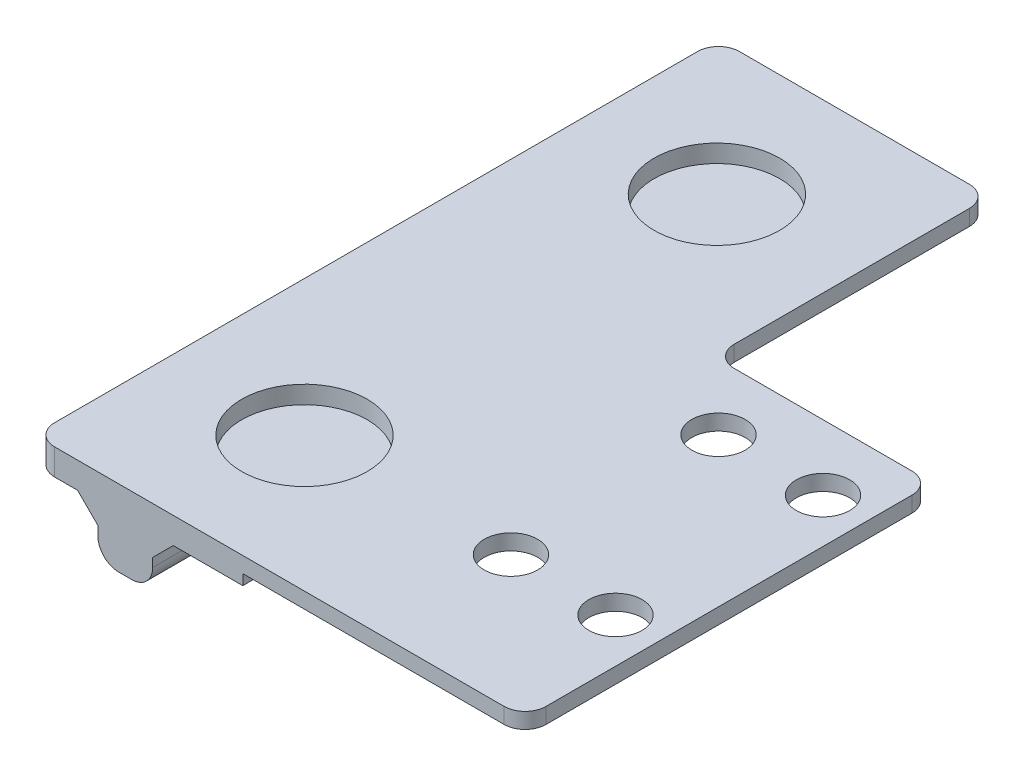
ISO-10303-21;
HEADER;
FILE_DESCRIPTION(('STEP AP214'),'2;1');
FILE_NAME('part.step','',(''),(''),'','','');
FILE_SCHEMA(('AUTOMOTIVE_DESIGN { 1 0 10303 214 1 1 1 1 }'));
ENDSEC;
DATA;
#1=APPLICATION_CONTEXT('core data for automotive mechanical design processes');
#2=APPLICATION_PROTOCOL_DEFINITION('international standard','automotive_design',2000,#1);
#3=PRODUCT_CONTEXT('',#1,'mechanical');
#4=PRODUCT('Part','Part','',(#3));
#5=PRODUCT_RELATED_PRODUCT_CATEGORY('part','',(#4));
#6=PRODUCT_DEFINITION_FORMATION('','',#4);
#7=PRODUCT_DEFINITION_CONTEXT('part definition',#1,'design');
#8=PRODUCT_DEFINITION('design','',#6,#7);
#9=PRODUCT_DEFINITION_SHAPE('','',#8);
#10=(LENGTH_UNIT() NAMED_UNIT(*) SI_UNIT(.MILLI.,.METRE.));
#11=(NAMED_UNIT(*) PLANE_ANGLE_UNIT() SI_UNIT($,.RADIAN.));
#12=(NAMED_UNIT(*) SI_UNIT($,.STERADIAN.) SOLID_ANGLE_UNIT());
#13=UNCERTAINTY_MEASURE_WITH_UNIT(LENGTH_MEASURE(1.E-05),#10,'distance_accuracy_value','');
#14=(GEOMETRIC_REPRESENTATION_CONTEXT(3) GLOBAL_UNCERTAINTY_ASSIGNED_CONTEXT((#13)) GLOBAL_UNIT_ASSIGNED_CONTEXT((#10,
#11,#12)) REPRESENTATION_CONTEXT('',''));
#15=CARTESIAN_POINT('',(0.,0.,0.));
#16=DIRECTION('',(0.,0.,1.));
#17=DIRECTION('',(1.,0.,0.));
#18=AXIS2_PLACEMENT_3D('',#15,#16,#17);
#19=CARTESIAN_POINT('',(-9.99999999999999,1.25,65.5));
#20=DIRECTION('',(0.,-1.,0.));
#21=DIRECTION('',(0.,0.,-1.));
#22=AXIS2_PLACEMENT_3D('',#19,#20,#21);
#23=PLANE('',#22);
#24=CARTESIAN_POINT('',(2.75,1.25,12.9));
#25=DIRECTION('',(0.,-1.,0.));
#26=DIRECTION('',(0.,0.,-1.));
#27=AXIS2_PLACEMENT_3D('',#24,#25,#26);
#28=CIRCLE('',#27,6.);
#29=CARTESIAN_POINT('',(2.75,1.25,6.9));
#30=VERTEX_POINT('',#29);
#31=EDGE_CURVE('E390',#30,#30,#28,.T.);
#32=ORIENTED_EDGE('',*,*,#31,.T.);
#33=EDGE_LOOP('',(#32));
#34=FACE_BOUND('',#33,.T.);
#35=CARTESIAN_POINT('',(3.00000000000001,1.25,52.6));
#36=DIRECTION('',(0.,-1.,0.));
#37=DIRECTION('',(0.,0.,-1.));
#38=AXIS2_PLACEMENT_3D('',#35,#36,#37);
#39=CIRCLE('',#38,6.);
#40=CARTESIAN_POINT('',(3.00000000000001,1.25,46.6));
#41=VERTEX_POINT('',#40);
#42=EDGE_CURVE('E383',#41,#41,#39,.T.);
#43=ORIENTED_EDGE('',*,*,#42,.T.);
#44=EDGE_LOOP('',(#43));
#45=FACE_BOUND('',#44,.T.);
#46=DIRECTION('',(0.,0.,-1.));
#47=VECTOR('',#46,1.);
#48=CARTESIAN_POINT('',(16.,1.25,65.5));
#49=LINE('',#48,#47);
#50=CARTESIAN_POINT('',(16.,1.25,24.5));
#51=VERTEX_POINT('',#50);
#52=CARTESIAN_POINT('',(16.,1.25,2.));
#53=VERTEX_POINT('',#52);
#54=EDGE_CURVE('E226',#51,#53,#49,.T.);
#55=ORIENTED_EDGE('',*,*,#54,.T.);
#56=CARTESIAN_POINT('',(14.,1.25,2.));
#57=DIRECTION('',(0.,-1.,0.));
#58=DIRECTION('',(0.,0.,-1.));
#59=AXIS2_PLACEMENT_3D('',#56,#57,#58);
#60=CIRCLE('',#59,2.);
#61=CARTESIAN_POINT('',(14.,1.25,0.));
#62=VERTEX_POINT('',#61);
#63=EDGE_CURVE('E287',#53,#62,#60,.F.);
#64=ORIENTED_EDGE('',*,*,#63,.T.);
#65=DIRECTION('',(-1.,0.,0.));
#66=VECTOR('',#65,1.);
#67=CARTESIAN_POINT('',(-9.99999999999999,1.25,0.));
#68=LINE('',#67,#66);
#69=CARTESIAN_POINT('',(-7.99999999999999,1.25,0.));
#70=VERTEX_POINT('',#69);
#71=EDGE_CURVE('E227',#62,#70,#68,.T.);
#72=ORIENTED_EDGE('',*,*,#71,.T.);
#73=CARTESIAN_POINT('',(-7.99999999999999,1.25,2.));
#74=DIRECTION('',(0.,-1.,0.));
#75=DIRECTION('',(0.,0.,-1.));
#76=AXIS2_PLACEMENT_3D('',#73,#74,#75);
#77=CIRCLE('',#76,2.);
#78=CARTESIAN_POINT('',(-9.99999999999999,1.25,2.));
#79=VERTEX_POINT('',#78);
#80=EDGE_CURVE('E283',#70,#79,#77,.F.);
#81=ORIENTED_EDGE('',*,*,#80,.T.);
#82=DIRECTION('',(0.,0.,-1.));
#83=VECTOR('',#82,1.);
#84=CARTESIAN_POINT('',(-9.99999999999999,1.25,65.5));
#85=LINE('',#84,#83);
#86=CARTESIAN_POINT('',(-9.99999999999999,1.25,63.5));
#87=VERTEX_POINT('',#86);
#88=EDGE_CURVE('E270',#87,#79,#85,.T.);
#89=ORIENTED_EDGE('',*,*,#88,.F.);
#90=CARTESIAN_POINT('',(-7.99999999999999,1.25,63.5));
#91=DIRECTION('',(0.,-1.,0.));
#92=DIRECTION('',(0.,0.,-1.));
#93=AXIS2_PLACEMENT_3D('',#90,#91,#92);
#94=CIRCLE('',#93,2.);
#95=CARTESIAN_POINT('',(-7.99999999999999,1.25,65.5));
#96=VERTEX_POINT('',#95);
#97=EDGE_CURVE('E285',#87,#96,#94,.F.);
#98=ORIENTED_EDGE('',*,*,#97,.T.);
#99=DIRECTION('',(-1.,0.,0.));
#100=VECTOR('',#99,1.);
#101=CARTESIAN_POINT('',(10.,1.25,65.5));
#102=LINE('',#101,#100);
#103=CARTESIAN_POINT('',(35.,1.25,65.5));
#104=VERTEX_POINT('',#103);
#105=EDGE_CURVE('E192',#104,#96,#102,.T.);
#106=ORIENTED_EDGE('',*,*,#105,.F.);
#107=CARTESIAN_POINT('',(35.,1.25,63.5));
#108=DIRECTION('',(0.,-1.,0.));
#109=DIRECTION('',(0.,0.,-1.));
#110=AXIS2_PLACEMENT_3D('',#107,#108,#109);
#111=CIRCLE('',#110,2.);
#112=CARTESIAN_POINT('',(37.,1.25,63.5));
#113=VERTEX_POINT('',#112);
#114=EDGE_CURVE('E279',#104,#113,#111,.F.);
#115=ORIENTED_EDGE('',*,*,#114,.T.);
#116=DIRECTION('',(0.,0.,1.));
#117=VECTOR('',#116,1.);
#118=CARTESIAN_POINT('',(37.,1.25,65.5));
#119=LINE('',#118,#117);
#120=CARTESIAN_POINT('',(37.,1.25,28.5));
#121=VERTEX_POINT('',#120);
#122=EDGE_CURVE('E407',#121,#113,#119,.T.);
#123=ORIENTED_EDGE('',*,*,#122,.F.);
#124=CARTESIAN_POINT('',(35.,1.25,28.5));
#125=DIRECTION('',(0.,-1.,0.));
#126=DIRECTION('',(0.,0.,-1.));
#127=AXIS2_PLACEMENT_3D('',#124,#125,#126);
#128=CIRCLE('',#127,2.);
#129=CARTESIAN_POINT('',(35.,1.25,26.5));
#130=VERTEX_POINT('',#129);
#131=EDGE_CURVE('E281',#121,#130,#128,.F.);
#132=ORIENTED_EDGE('',*,*,#131,.T.);
#133=DIRECTION('',(1.,0.,0.));
#134=VECTOR('',#133,1.);
#135=CARTESIAN_POINT('',(16.,1.25,26.5));
#136=LINE('',#135,#134);
#137=CARTESIAN_POINT('',(18.,1.25,26.5));
#138=VERTEX_POINT('',#137);
#139=EDGE_CURVE('E358',#138,#130,#136,.T.);
#140=ORIENTED_EDGE('',*,*,#139,.F.);
#141=CARTESIAN_POINT('',(18.,1.25,24.5));
#142=DIRECTION('',(0.,-1.,0.));
#143=DIRECTION('',(0.,0.,-1.));
#144=AXIS2_PLACEMENT_3D('',#141,#142,#143);
#145=CIRCLE('',#144,2.);
#146=EDGE_CURVE('E11',#138,#51,#145,.T.);
#147=ORIENTED_EDGE('',*,*,#146,.T.);
#148=EDGE_LOOP('',(#55,#64,#72,#81,#89,#98,#106,#115,#123,#132,#140,#147));
#149=FACE_BOUND('',#148,.T.);
#150=CARTESIAN_POINT('',(22.75,1.25,32.75));
#151=DIRECTION('',(0.,-1.,0.));
#152=DIRECTION('',(0.,0.,-1.));
#153=AXIS2_PLACEMENT_3D('',#150,#151,#152);
#154=CIRCLE('',#153,2.55);
#155=CARTESIAN_POINT('',(22.75,1.25,30.2));
#156=VERTEX_POINT('',#155);
#157=EDGE_CURVE('E395',#156,#156,#154,.T.);
#158=ORIENTED_EDGE('',*,*,#157,.T.);
#159=EDGE_LOOP('',(#158));
#160=FACE_BOUND('',#159,.T.);
#161=CARTESIAN_POINT('',(22.75,1.25,52.6));
#162=DIRECTION('',(0.,-1.,0.));
#163=DIRECTION('',(0.,0.,-1.));
#164=AXIS2_PLACEMENT_3D('',#161,#162,#163);
#165=CIRCLE('',#164,2.55);
#166=CARTESIAN_POINT('',(22.75,1.25,50.05));
#167=VERTEX_POINT('',#166);
#168=EDGE_CURVE('E398',#167,#167,#165,.T.);
#169=ORIENTED_EDGE('',*,*,#168,.T.);
#170=EDGE_LOOP('',(#169));
#171=FACE_BOUND('',#170,.T.);
#172=CARTESIAN_POINT('',(32.75,1.25,32.75));
#173=DIRECTION('',(0.,-1.,0.));
#174=DIRECTION('',(0.,0.,-1.));
#175=AXIS2_PLACEMENT_3D('',#172,#173,#174);
#176=CIRCLE('',#175,2.55);
#177=CARTESIAN_POINT('',(32.75,1.25,30.2));
#178=VERTEX_POINT('',#177);
#179=EDGE_CURVE('E401',#178,#178,#176,.T.);
#180=ORIENTED_EDGE('',*,*,#179,.T.);
#181=EDGE_LOOP('',(#180));
#182=FACE_BOUND('',#181,.T.);
#183=CARTESIAN_POINT('',(32.75,1.25,52.6));
#184=DIRECTION('',(0.,-1.,0.));
#185=DIRECTION('',(0.,0.,-1.));
#186=AXIS2_PLACEMENT_3D('',#183,#184,#185);
#187=CIRCLE('',#186,2.55);
#188=CARTESIAN_POINT('',(32.75,1.25,50.05));
#189=VERTEX_POINT('',#188);
#190=EDGE_CURVE('E387',#189,#189,#187,.T.);
#191=ORIENTED_EDGE('',*,*,#190,.T.);
#192=EDGE_LOOP('',(#191));
#193=FACE_BOUND('',#192,.T.);
#194=ADVANCED_FACE('F33',(#34,#45,#149,#160,#171,#182,#193),#23,.F.);
#195=CARTESIAN_POINT('',(-9.99999999999999,-1.25,65.5));
#196=DIRECTION('',(1.,0.,0.));
#197=DIRECTION('',(0.,0.,-1.));
#198=AXIS2_PLACEMENT_3D('',#195,#196,#197);
#199=PLANE('',#198);
#200=DIRECTION('',(0.,0.,-1.));
#201=VECTOR('',#200,1.);
#202=CARTESIAN_POINT('',(-9.99999999999999,-1.25,65.5));
#203=LINE('',#202,#201);
#204=CARTESIAN_POINT('',(-9.99999999999999,-1.25,63.5));
#205=VERTEX_POINT('',#204);
#206=CARTESIAN_POINT('',(-9.99999999999999,-1.25,2.));
#207=VERTEX_POINT('',#206);
#208=EDGE_CURVE('E201',#205,#207,#203,.T.);
#209=ORIENTED_EDGE('',*,*,#208,.F.);
#210=DIRECTION('',(0.,-1.,0.));
#211=VECTOR('',#210,1.);
#212=CARTESIAN_POINT('',(-9.99999999999999,-1.25,63.5));
#213=LINE('',#212,#211);
#214=EDGE_CURVE('E314',#205,#87,#213,.F.);
#215=ORIENTED_EDGE('',*,*,#214,.T.);
#216=ORIENTED_EDGE('',*,*,#88,.T.);
#217=DIRECTION('',(0.,-1.,0.));
#218=VECTOR('',#217,1.);
#219=CARTESIAN_POINT('',(-9.99999999999999,-1.25,2.));
#220=LINE('',#219,#218);
#221=EDGE_CURVE('E312',#79,#207,#220,.T.);
#222=ORIENTED_EDGE('',*,*,#221,.T.);
#223=EDGE_LOOP('',(#209,#215,#216,#222));
#224=FACE_BOUND('',#223,.T.);
#225=ADVANCED_FACE('F375',(#224),#199,.F.);
#226=CARTESIAN_POINT('',(-9.99999999999999,-1.25,65.5));
#227=DIRECTION('',(0.,1.,0.));
#228=DIRECTION('',(-1.,0.,0.));
#229=AXIS2_PLACEMENT_3D('',#226,#227,#228);
#230=PLANE('',#229);
#231=DIRECTION('',(1.,0.,0.));
#232=VECTOR('',#231,1.);
#233=CARTESIAN_POINT('',(-9.99999999999999,-1.25,65.5));
#234=LINE('',#233,#232);
#235=CARTESIAN_POINT('',(-7.99999999999999,-1.25,65.5));
#236=VERTEX_POINT('',#235);
#237=CARTESIAN_POINT('',(-5.79999999999999,-1.25,65.5));
#238=VERTEX_POINT('',#237);
#239=EDGE_CURVE('E182',#236,#238,#234,.T.);
#240=ORIENTED_EDGE('',*,*,#239,.F.);
#241=CARTESIAN_POINT('',(-7.99999999999999,-1.25,63.5));
#242=DIRECTION('',(0.,1.,0.));
#243=DIRECTION('',(-1.,0.,0.));
#244=AXIS2_PLACEMENT_3D('',#241,#242,#243);
#245=CIRCLE('',#244,2.);
#246=EDGE_CURVE('E56',#236,#205,#245,.F.);
#247=ORIENTED_EDGE('',*,*,#246,.T.);
#248=ORIENTED_EDGE('',*,*,#208,.T.);
#249=CARTESIAN_POINT('',(-7.99999999999999,-1.25,2.));
#250=DIRECTION('',(0.,1.,0.));
#251=DIRECTION('',(-1.,0.,0.));
#252=AXIS2_PLACEMENT_3D('',#249,#250,#251);
#253=CIRCLE('',#252,2.);
#254=CARTESIAN_POINT('',(-7.99999999999999,-1.25,0.));
#255=VERTEX_POINT('',#254);
#256=EDGE_CURVE('E48',#207,#255,#253,.F.);
#257=ORIENTED_EDGE('',*,*,#256,.T.);
#258=DIRECTION('',(1.,0.,0.));
#259=VECTOR('',#258,1.);
#260=CARTESIAN_POINT('',(-9.99999999999999,-1.25,0.));
#261=LINE('',#260,#259);
#262=CARTESIAN_POINT('',(-5.79999999999999,-1.25,0.));
#263=VERTEX_POINT('',#262);
#264=EDGE_CURVE('E198',#255,#263,#261,.T.);
#265=ORIENTED_EDGE('',*,*,#264,.T.);
#266=DIRECTION('',(0.,0.,-1.));
#267=VECTOR('',#266,1.);
#268=CARTESIAN_POINT('',(-5.79999999999999,-1.25,65.5));
#269=LINE('',#268,#267);
#270=EDGE_CURVE('E195',#238,#263,#269,.T.);
#271=ORIENTED_EDGE('',*,*,#270,.F.);
#272=EDGE_LOOP('',(#240,#247,#248,#257,#265,#271));
#273=FACE_BOUND('',#272,.T.);
#274=ADVANCED_FACE('F196',(#273),#230,.F.);
#275=CARTESIAN_POINT('',(-5.79999999999999,-1.25,65.5));
#276=DIRECTION('',(0.707106781186548,0.707106781186546,0.));
#277=DIRECTION('',(-0.707106781186547,0.707106781186549,0.));
#278=AXIS2_PLACEMENT_3D('',#275,#276,#277);
#279=PLANE('',#278);
#280=DIRECTION('',(0.707106781186546,-0.707106781186548,0.));
#281=VECTOR('',#280,1.);
#282=CARTESIAN_POINT('',(-5.79999999999999,-1.25,0.));
#283=LINE('',#282,#281);
#284=CARTESIAN_POINT('',(-3.86134836843665,-3.18865163156335,0.));
#285=VERTEX_POINT('',#284);
#286=EDGE_CURVE('E232',#263,#285,#283,.T.);
#287=ORIENTED_EDGE('',*,*,#286,.T.);
#288=DIRECTION('',(0.,0.,-1.));
#289=VECTOR('',#288,1.);
#290=CARTESIAN_POINT('',(-3.86134836843665,-3.18865163156335,65.5));
#291=LINE('',#290,#289);
#292=CARTESIAN_POINT('',(-3.86134836843665,-3.18865163156335,65.5));
#293=VERTEX_POINT('',#292);
#294=EDGE_CURVE('E202',#293,#285,#291,.T.);
#295=ORIENTED_EDGE('',*,*,#294,.F.);
#296=DIRECTION('',(0.707106781186546,-0.707106781186548,0.));
#297=VECTOR('',#296,1.);
#298=CARTESIAN_POINT('',(-5.79999999999999,-1.25,65.5));
#299=LINE('',#298,#297);
#300=EDGE_CURVE('E188',#238,#293,#299,.T.);
#301=ORIENTED_EDGE('',*,*,#300,.F.);
#302=ORIENTED_EDGE('',*,*,#270,.T.);
#303=EDGE_LOOP('',(#287,#295,#301,#302));
#304=FACE_BOUND('',#303,.T.);
#305=ADVANCED_FACE('F204',(#304),#279,.F.);
#306=CARTESIAN_POINT('',(-3.86134836843665,-3.18865163156335,65.5));
#307=DIRECTION('',(1.,0.,0.));
#308=DIRECTION('',(0.,1.,0.));
#309=AXIS2_PLACEMENT_3D('',#306,#307,#308);
#310=PLANE('',#309);
#311=DIRECTION('',(0.,-1.,0.));
#312=VECTOR('',#311,1.);
#313=CARTESIAN_POINT('',(-3.86134836843665,-3.18865163156335,0.));
#314=LINE('',#313,#312);
#315=CARTESIAN_POINT('',(-3.86134836843665,-4.05853443117383,0.));
#316=VERTEX_POINT('',#315);
#317=EDGE_CURVE('E234',#285,#316,#314,.T.);
#318=ORIENTED_EDGE('',*,*,#317,.T.);
#319=DIRECTION('',(0.,0.,-1.));
#320=VECTOR('',#319,1.);
#321=CARTESIAN_POINT('',(-3.86134836843665,-4.05853443117383,65.5));
#322=LINE('',#321,#320);
#323=CARTESIAN_POINT('',(-3.86134836843665,-4.05853443117383,65.5));
#324=VERTEX_POINT('',#323);
#325=EDGE_CURVE('E334',#316,#324,#322,.F.);
#326=ORIENTED_EDGE('',*,*,#325,.T.);
#327=DIRECTION('',(0.,-1.,0.));
#328=VECTOR('',#327,1.);
#329=CARTESIAN_POINT('',(-3.86134836843665,-3.18865163156335,65.5));
#330=LINE('',#329,#328);
#331=EDGE_CURVE('E207',#293,#324,#330,.T.);
#332=ORIENTED_EDGE('',*,*,#331,.F.);
#333=ORIENTED_EDGE('',*,*,#294,.T.);
#334=EDGE_LOOP('',(#318,#326,#332,#333));
#335=FACE_BOUND('',#334,.T.);
#336=ADVANCED_FACE('F550',(#335),#310,.F.);
#337=CARTESIAN_POINT('',(-3.86134836843665,-6.05853443117383,65.5));
#338=DIRECTION('',(0.,1.,0.));
#339=DIRECTION('',(-1.,0.,0.));
#340=AXIS2_PLACEMENT_3D('',#337,#338,#339);
#341=PLANE('',#340);
#342=DIRECTION('',(1.,0.,0.));
#343=VECTOR('',#342,1.);
#344=CARTESIAN_POINT('',(-3.86134836843665,-6.05853443117383,0.));
#345=LINE('',#344,#343);
#346=CARTESIAN_POINT('',(-1.86134836843665,-6.05853443117383,0.));
#347=VERTEX_POINT('',#346);
#348=CARTESIAN_POINT('',(-0.619594871204725,-6.05853443117383,0.));
#349=VERTEX_POINT('',#348);
#350=EDGE_CURVE('E237',#347,#349,#345,.T.);
#351=ORIENTED_EDGE('',*,*,#350,.T.);
#352=DIRECTION('',(0.,0.,-1.));
#353=VECTOR('',#352,1.);
#354=CARTESIAN_POINT('',(-0.619594871204725,-6.05853443117383,65.5));
#355=LINE('',#354,#353);
#356=CARTESIAN_POINT('',(-0.619594871204725,-6.05853443117383,65.5));
#357=VERTEX_POINT('',#356);
#358=EDGE_CURVE('E332',#349,#357,#355,.F.);
#359=ORIENTED_EDGE('',*,*,#358,.T.);
#360=DIRECTION('',(1.,0.,0.));
#361=VECTOR('',#360,1.);
#362=CARTESIAN_POINT('',(-3.86134836843665,-6.05853443117383,65.5));
#363=LINE('',#362,#361);
#364=CARTESIAN_POINT('',(-1.86134836843665,-6.05853443117383,65.5));
#365=VERTEX_POINT('',#364);
#366=EDGE_CURVE('E209',#365,#357,#363,.T.);
#367=ORIENTED_EDGE('',*,*,#366,.F.);
#368=DIRECTION('',(0.,0.,-1.));
#369=VECTOR('',#368,1.);
#370=CARTESIAN_POINT('',(-1.86134836843665,-6.05853443117383,65.5));
#371=LINE('',#370,#369);
#372=EDGE_CURVE('E329',#365,#347,#371,.T.);
#373=ORIENTED_EDGE('',*,*,#372,.T.);
#374=EDGE_LOOP('',(#351,#359,#367,#373));
#375=FACE_BOUND('',#374,.T.);
#376=ADVANCED_FACE('F547',(#375),#341,.F.);
#377=CARTESIAN_POINT('',(1.38040512879528,-6.05853443117383,65.5));
#378=DIRECTION('',(-1.,0.,0.));
#379=DIRECTION('',(0.,-1.,0.));
#380=AXIS2_PLACEMENT_3D('',#377,#378,#379);
#381=PLANE('',#380);
#382=DIRECTION('',(0.,1.,0.));
#383=VECTOR('',#382,1.);
#384=CARTESIAN_POINT('',(1.38040512879528,-6.05853443117383,65.5));
#385=LINE('',#384,#383);
#386=CARTESIAN_POINT('',(1.38040512879527,-4.05853443117382,65.5));
#387=VERTEX_POINT('',#386);
#388=CARTESIAN_POINT('',(1.38040512879527,-3.21959487120471,65.5));
#389=VERTEX_POINT('',#388);
#390=EDGE_CURVE('E215',#387,#389,#385,.T.);
#391=ORIENTED_EDGE('',*,*,#390,.F.);
#392=DIRECTION('',(0.,0.,-1.));
#393=VECTOR('',#392,1.);
#394=CARTESIAN_POINT('',(1.38040512879527,-4.05853443117382,65.5));
#395=LINE('',#394,#393);
#396=CARTESIAN_POINT('',(1.38040512879527,-4.05853443117382,0.));
#397=VERTEX_POINT('',#396);
#398=EDGE_CURVE('E326',#387,#397,#395,.T.);
#399=ORIENTED_EDGE('',*,*,#398,.T.);
#400=DIRECTION('',(0.,1.,0.));
#401=VECTOR('',#400,1.);
#402=CARTESIAN_POINT('',(1.38040512879528,-6.05853443117383,0.));
#403=LINE('',#402,#401);
#404=CARTESIAN_POINT('',(1.38040512879527,-3.21959487120471,0.));
#405=VERTEX_POINT('',#404);
#406=EDGE_CURVE('E240',#397,#405,#403,.T.);
#407=ORIENTED_EDGE('',*,*,#406,.T.);
#408=DIRECTION('',(0.,0.,-1.));
#409=VECTOR('',#408,1.);
#410=CARTESIAN_POINT('',(1.38040512879527,-3.21959487120471,65.5));
#411=LINE('',#410,#409);
#412=EDGE_CURVE('E265',#389,#405,#411,.T.);
#413=ORIENTED_EDGE('',*,*,#412,.F.);
#414=EDGE_LOOP('',(#391,#399,#407,#413));
#415=FACE_BOUND('',#414,.T.);
#416=ADVANCED_FACE('F486',(#415),#381,.F.);
#417=CARTESIAN_POINT('',(3.35000000000001,-1.25,65.5));
#418=DIRECTION('',(-0.707106781186544,0.707106781186551,0.));
#419=DIRECTION('',(-0.707106781186551,-0.707106781186544,0.));
#420=AXIS2_PLACEMENT_3D('',#417,#418,#419);
#421=PLANE('',#420);
#422=DIRECTION('',(0.707106781186551,0.707106781186544,0.));
#423=VECTOR('',#422,1.);
#424=CARTESIAN_POINT('',(3.35000000000001,-1.25,0.));
#425=LINE('',#424,#423);
#426=CARTESIAN_POINT('',(3.35000000000001,-1.25,0.));
#427=VERTEX_POINT('',#426);
#428=EDGE_CURVE('E242',#405,#427,#425,.T.);
#429=ORIENTED_EDGE('',*,*,#428,.T.);
#430=DIRECTION('',(0.,0.,-1.));
#431=VECTOR('',#430,1.);
#432=CARTESIAN_POINT('',(3.35000000000001,-1.25,65.5));
#433=LINE('',#432,#431);
#434=CARTESIAN_POINT('',(3.35000000000001,-1.25,65.5));
#435=VERTEX_POINT('',#434);
#436=EDGE_CURVE('E262',#435,#427,#433,.T.);
#437=ORIENTED_EDGE('',*,*,#436,.F.);
#438=DIRECTION('',(0.707106781186551,0.707106781186544,0.));
#439=VECTOR('',#438,1.);
#440=CARTESIAN_POINT('',(3.35000000000001,-1.25,65.5));
#441=LINE('',#440,#439);
#442=EDGE_CURVE('E217',#389,#435,#441,.T.);
#443=ORIENTED_EDGE('',*,*,#442,.F.);
#444=ORIENTED_EDGE('',*,*,#412,.T.);
#445=EDGE_LOOP('',(#429,#437,#443,#444));
#446=FACE_BOUND('',#445,.T.);
#447=ADVANCED_FACE('F492',(#446),#421,.F.);
#448=CARTESIAN_POINT('',(3.35000000000001,-1.25,65.5));
#449=DIRECTION('',(0.,1.,0.));
#450=DIRECTION('',(0.,0.,1.));
#451=AXIS2_PLACEMENT_3D('',#448,#449,#450);
#452=PLANE('',#451);
#453=DIRECTION('',(1.,0.,0.));
#454=VECTOR('',#453,1.);
#455=CARTESIAN_POINT('',(3.35000000000001,-1.25,0.));
#456=LINE('',#455,#454);
#457=CARTESIAN_POINT('',(10.,-1.25,0.));
#458=VERTEX_POINT('',#457);
#459=EDGE_CURVE('E244',#427,#458,#456,.T.);
#460=ORIENTED_EDGE('',*,*,#459,.T.);
#461=DIRECTION('',(0.,0.,-1.));
#462=VECTOR('',#461,1.);
#463=CARTESIAN_POINT('',(10.,-1.25,65.5));
#464=LINE('',#463,#462);
#465=CARTESIAN_POINT('',(10.,-1.25,65.5));
#466=VERTEX_POINT('',#465);
#467=EDGE_CURVE('E259',#466,#458,#464,.T.);
#468=ORIENTED_EDGE('',*,*,#467,.F.);
#469=DIRECTION('',(1.,0.,0.));
#470=VECTOR('',#469,1.);
#471=CARTESIAN_POINT('',(3.35000000000001,-1.25,65.5));
#472=LINE('',#471,#470);
#473=EDGE_CURVE('E219',#435,#466,#472,.T.);
#474=ORIENTED_EDGE('',*,*,#473,.F.);
#475=ORIENTED_EDGE('',*,*,#436,.T.);
#476=EDGE_LOOP('',(#460,#468,#474,#475));
#477=FACE_BOUND('',#476,.T.);
#478=ADVANCED_FACE('F498',(#477),#452,.F.);
#479=CARTESIAN_POINT('',(10.,-1.25,65.5));
#480=DIRECTION('',(-1.,0.,0.));
#481=DIRECTION('',(0.,0.,1.));
#482=AXIS2_PLACEMENT_3D('',#479,#480,#481);
#483=PLANE('',#482);
#484=DIRECTION('',(0.,1.,0.));
#485=VECTOR('',#484,1.);
#486=CARTESIAN_POINT('',(10.,-1.25,0.));
#487=LINE('',#486,#485);
#488=CARTESIAN_POINT('',(10.,-0.249999999999999,0.));
#489=VERTEX_POINT('',#488);
#490=EDGE_CURVE('E246',#458,#489,#487,.T.);
#491=ORIENTED_EDGE('',*,*,#490,.T.);
#492=DIRECTION('',(0.,0.,-1.));
#493=VECTOR('',#492,1.);
#494=CARTESIAN_POINT('',(10.,-0.249999999999999,65.5));
#495=LINE('',#494,#493);
#496=CARTESIAN_POINT('',(10.,-0.249999999999999,65.5));
#497=VERTEX_POINT('',#496);
#498=EDGE_CURVE('E256',#497,#489,#495,.T.);
#499=ORIENTED_EDGE('',*,*,#498,.F.);
#500=DIRECTION('',(0.,1.,0.));
#501=VECTOR('',#500,1.);
#502=CARTESIAN_POINT('',(10.,-1.25,65.5));
#503=LINE('',#502,#501);
#504=EDGE_CURVE('E221',#466,#497,#503,.T.);
#505=ORIENTED_EDGE('',*,*,#504,.F.);
#506=ORIENTED_EDGE('',*,*,#467,.T.);
#507=EDGE_LOOP('',(#491,#499,#505,#506));
#508=FACE_BOUND('',#507,.T.);
#509=ADVANCED_FACE('F428',(#508),#483,.F.);
#510=CARTESIAN_POINT('',(10.,-0.249999999999999,65.5));
#511=DIRECTION('',(0.,1.,0.));
#512=DIRECTION('',(0.,0.,1.));
#513=AXIS2_PLACEMENT_3D('',#510,#511,#512);
#514=PLANE('',#513);
#515=DIRECTION('',(1.,0.,0.));
#516=VECTOR('',#515,1.);
#517=CARTESIAN_POINT('',(10.,-0.249999999999999,0.));
#518=LINE('',#517,#516);
#519=CARTESIAN_POINT('',(14.,-0.249999999999999,0.));
#520=VERTEX_POINT('',#519);
#521=EDGE_CURVE('E248',#489,#520,#518,.T.);
#522=ORIENTED_EDGE('',*,*,#521,.T.);
#523=CARTESIAN_POINT('',(14.,-0.249999999999999,2.));
#524=DIRECTION('',(0.,1.,0.));
#525=DIRECTION('',(0.,0.,1.));
#526=AXIS2_PLACEMENT_3D('',#523,#524,#525);
#527=CIRCLE('',#526,2.);
#528=CARTESIAN_POINT('',(16.,-0.249999999999999,2.));
#529=VERTEX_POINT('',#528);
#530=EDGE_CURVE('E301',#520,#529,#527,.F.);
#531=ORIENTED_EDGE('',*,*,#530,.T.);
#532=DIRECTION('',(0.,0.,-1.));
#533=VECTOR('',#532,1.);
#534=CARTESIAN_POINT('',(16.,-0.249999999999999,65.5));
#535=LINE('',#534,#533);
#536=CARTESIAN_POINT('',(16.,-0.249999999999999,24.5));
#537=VERTEX_POINT('',#536);
#538=EDGE_CURVE('E253',#537,#529,#535,.T.);
#539=ORIENTED_EDGE('',*,*,#538,.F.);
#540=CARTESIAN_POINT('',(18.,-0.249999999999999,24.5));
#541=DIRECTION('',(0.,1.,0.));
#542=DIRECTION('',(0.,0.,1.));
#543=AXIS2_PLACEMENT_3D('',#540,#541,#542);
#544=CIRCLE('',#543,2.);
#545=CARTESIAN_POINT('',(18.,-0.25,26.5));
#546=VERTEX_POINT('',#545);
#547=EDGE_CURVE('E41',#537,#546,#544,.T.);
#548=ORIENTED_EDGE('',*,*,#547,.T.);
#549=DIRECTION('',(1.,0.,0.));
#550=VECTOR('',#549,1.);
#551=CARTESIAN_POINT('',(16.,-0.25,26.5));
#552=LINE('',#551,#550);
#553=CARTESIAN_POINT('',(35.,-0.25,26.5));
#554=VERTEX_POINT('',#553);
#555=EDGE_CURVE('E341',#546,#554,#552,.T.);
#556=ORIENTED_EDGE('',*,*,#555,.T.);
#557=CARTESIAN_POINT('',(35.,-0.25,28.5));
#558=DIRECTION('',(0.,1.,0.));
#559=DIRECTION('',(0.,0.,1.));
#560=AXIS2_PLACEMENT_3D('',#557,#558,#559);
#561=CIRCLE('',#560,2.);
#562=CARTESIAN_POINT('',(37.,-0.25,28.5));
#563=VERTEX_POINT('',#562);
#564=EDGE_CURVE('E299',#554,#563,#561,.F.);
#565=ORIENTED_EDGE('',*,*,#564,.T.);
#566=DIRECTION('',(0.,0.,1.));
#567=VECTOR('',#566,1.);
#568=CARTESIAN_POINT('',(37.,-0.25,65.5));
#569=LINE('',#568,#567);
#570=CARTESIAN_POINT('',(37.,-0.25,63.5));
#571=VERTEX_POINT('',#570);
#572=EDGE_CURVE('E351',#563,#571,#569,.T.);
#573=ORIENTED_EDGE('',*,*,#572,.T.);
#574=CARTESIAN_POINT('',(35.,-0.25,63.5));
#575=DIRECTION('',(0.,1.,0.));
#576=DIRECTION('',(0.,0.,1.));
#577=AXIS2_PLACEMENT_3D('',#574,#575,#576);
#578=CIRCLE('',#577,2.);
#579=CARTESIAN_POINT('',(35.,-0.249999999999999,65.5));
#580=VERTEX_POINT('',#579);
#581=EDGE_CURVE('E297',#571,#580,#578,.F.);
#582=ORIENTED_EDGE('',*,*,#581,.T.);
#583=DIRECTION('',(1.,0.,0.));
#584=VECTOR('',#583,1.);
#585=CARTESIAN_POINT('',(10.,-0.249999999999999,65.5));
#586=LINE('',#585,#584);
#587=EDGE_CURVE('E223',#497,#580,#586,.T.);
#588=ORIENTED_EDGE('',*,*,#587,.F.);
#589=ORIENTED_EDGE('',*,*,#498,.T.);
#590=EDGE_LOOP('',(#522,#531,#539,#548,#556,#565,#573,#582,#588,#589));
#591=FACE_BOUND('',#590,.T.);
#592=CARTESIAN_POINT('',(32.75,-0.25,32.75));
#593=DIRECTION('',(0.,1.,0.));
#594=DIRECTION('',(0.,0.,1.));
#595=AXIS2_PLACEMENT_3D('',#592,#593,#594);
#596=CIRCLE('',#595,2.55);
#597=CARTESIAN_POINT('',(32.75,-0.25,35.3));
#598=VERTEX_POINT('',#597);
#599=EDGE_CURVE('E350',#598,#598,#596,.F.);
#600=ORIENTED_EDGE('',*,*,#599,.F.);
#601=EDGE_LOOP('',(#600));
#602=FACE_BOUND('',#601,.T.);
#603=CARTESIAN_POINT('',(22.75,-0.25,32.75));
#604=DIRECTION('',(0.,1.,0.));
#605=DIRECTION('',(0.,0.,1.));
#606=AXIS2_PLACEMENT_3D('',#603,#604,#605);
#607=CIRCLE('',#606,2.55);
#608=CARTESIAN_POINT('',(22.75,-0.25,35.3));
#609=VERTEX_POINT('',#608);
#610=EDGE_CURVE('E411',#609,#609,#607,.F.);
#611=ORIENTED_EDGE('',*,*,#610,.F.);
#612=EDGE_LOOP('',(#611));
#613=FACE_BOUND('',#612,.T.);
#614=CARTESIAN_POINT('',(22.75,-0.25,52.6));
#615=DIRECTION('',(0.,1.,0.));
#616=DIRECTION('',(0.,0.,1.));
#617=AXIS2_PLACEMENT_3D('',#614,#615,#616);
#618=CIRCLE('',#617,2.55);
#619=CARTESIAN_POINT('',(22.75,-0.25,55.15));
#620=VERTEX_POINT('',#619);
#621=EDGE_CURVE('E414',#620,#620,#618,.F.);
#622=ORIENTED_EDGE('',*,*,#621,.F.);
#623=EDGE_LOOP('',(#622));
#624=FACE_BOUND('',#623,.T.);
#625=CARTESIAN_POINT('',(32.75,-0.25,52.6));
#626=DIRECTION('',(0.,1.,0.));
#627=DIRECTION('',(0.,0.,1.));
#628=AXIS2_PLACEMENT_3D('',#625,#626,#627);
#629=CIRCLE('',#628,2.55);
#630=CARTESIAN_POINT('',(32.75,-0.25,55.15));
#631=VERTEX_POINT('',#630);
#632=EDGE_CURVE('E410',#631,#631,#629,.F.);
#633=ORIENTED_EDGE('',*,*,#632,.F.);
#634=EDGE_LOOP('',(#633));
#635=FACE_BOUND('',#634,.T.);
#636=ADVANCED_FACE('F339',(#591,#602,#613,#624,#635),#514,.F.);
#637=CARTESIAN_POINT('',(16.,1.25,65.5));
#638=DIRECTION('',(-1.,0.,0.));
#639=DIRECTION('',(0.,0.,1.));
#640=AXIS2_PLACEMENT_3D('',#637,#638,#639);
#641=PLANE('',#640);
#642=ORIENTED_EDGE('',*,*,#538,.T.);
#643=DIRECTION('',(0.,1.,0.));
#644=VECTOR('',#643,1.);
#645=CARTESIAN_POINT('',(16.,1.25,2.));
#646=LINE('',#645,#644);
#647=EDGE_CURVE('E276',#529,#53,#646,.T.);
#648=ORIENTED_EDGE('',*,*,#647,.T.);
#649=ORIENTED_EDGE('',*,*,#54,.F.);
#650=DIRECTION('',(0.,-1.,0.));
#651=VECTOR('',#650,1.);
#652=CARTESIAN_POINT('',(16.,-0.249999999999999,24.5));
#653=LINE('',#652,#651);
#654=EDGE_CURVE('E273',#51,#537,#653,.T.);
#655=ORIENTED_EDGE('',*,*,#654,.T.);
#656=EDGE_LOOP('',(#642,#648,#649,#655));
#657=FACE_BOUND('',#656,.T.);
#658=ADVANCED_FACE('F360',(#657),#641,.F.);
#659=CARTESIAN_POINT('',(0.,0.,65.5));
#660=DIRECTION('',(0.,0.,-1.));
#661=DIRECTION('',(-1.,0.,0.));
#662=AXIS2_PLACEMENT_3D('',#659,#660,#661);
#663=PLANE('',#662);
#664=ORIENTED_EDGE('',*,*,#105,.T.);
#665=DIRECTION('',(0.,-1.,0.));
#666=VECTOR('',#665,1.);
#667=CARTESIAN_POINT('',(-7.99999999999999,0.,65.5));
#668=LINE('',#667,#666);
#669=EDGE_CURVE('E191',#96,#236,#668,.T.);
#670=ORIENTED_EDGE('',*,*,#669,.T.);
#671=ORIENTED_EDGE('',*,*,#239,.T.);
#672=ORIENTED_EDGE('',*,*,#300,.T.);
#673=ORIENTED_EDGE('',*,*,#331,.T.);
#674=CARTESIAN_POINT('',(-1.86134836843665,-4.05853443117383,65.5));
#675=DIRECTION('',(0.,0.,-1.));
#676=DIRECTION('',(-1.,0.,0.));
#677=AXIS2_PLACEMENT_3D('',#674,#675,#676);
#678=CIRCLE('',#677,2.);
#679=EDGE_CURVE('E303',#324,#365,#678,.F.);
#680=ORIENTED_EDGE('',*,*,#679,.T.);
#681=ORIENTED_EDGE('',*,*,#366,.T.);
#682=CARTESIAN_POINT('',(-0.619594871204725,-4.05853443117383,65.5));
#683=DIRECTION('',(0.,0.,-1.));
#684=DIRECTION('',(-1.,0.,0.));
#685=AXIS2_PLACEMENT_3D('',#682,#683,#684);
#686=CIRCLE('',#685,2.);
#687=EDGE_CURVE('E305',#357,#387,#686,.F.);
#688=ORIENTED_EDGE('',*,*,#687,.T.);
#689=ORIENTED_EDGE('',*,*,#390,.T.);
#690=ORIENTED_EDGE('',*,*,#442,.T.);
#691=ORIENTED_EDGE('',*,*,#473,.T.);
#692=ORIENTED_EDGE('',*,*,#504,.T.);
#693=ORIENTED_EDGE('',*,*,#587,.T.);
#694=DIRECTION('',(0.,-1.,0.));
#695=VECTOR('',#694,1.);
#696=CARTESIAN_POINT('',(35.,0.,65.5));
#697=LINE('',#696,#695);
#698=EDGE_CURVE('E307',#580,#104,#697,.F.);
#699=ORIENTED_EDGE('',*,*,#698,.T.);
#700=EDGE_LOOP('',(#664,#670,#671,#672,#673,#680,#681,#688,#689,#690,#691,#692,#693,#699));
#701=FACE_BOUND('',#700,.T.);
#702=ADVANCED_FACE('F185',(#701),#663,.F.);
#703=CARTESIAN_POINT('',(0.,0.,0.));
#704=DIRECTION('',(0.,0.,-1.));
#705=DIRECTION('',(-1.,0.,0.));
#706=AXIS2_PLACEMENT_3D('',#703,#704,#705);
#707=PLANE('',#706);
#708=ORIENTED_EDGE('',*,*,#71,.F.);
#709=DIRECTION('',(0.,1.,0.));
#710=VECTOR('',#709,1.);
#711=CARTESIAN_POINT('',(14.,-0.249999999999999,0.));
#712=LINE('',#711,#710);
#713=EDGE_CURVE('E295',#62,#520,#712,.F.);
#714=ORIENTED_EDGE('',*,*,#713,.T.);
#715=ORIENTED_EDGE('',*,*,#521,.F.);
#716=ORIENTED_EDGE('',*,*,#490,.F.);
#717=ORIENTED_EDGE('',*,*,#459,.F.);
#718=ORIENTED_EDGE('',*,*,#428,.F.);
#719=ORIENTED_EDGE('',*,*,#406,.F.);
#720=CARTESIAN_POINT('',(-0.619594871204725,-4.05853443117383,0.));
#721=DIRECTION('',(0.,0.,-1.));
#722=DIRECTION('',(-1.,0.,0.));
#723=AXIS2_PLACEMENT_3D('',#720,#721,#722);
#724=CIRCLE('',#723,2.);
#725=EDGE_CURVE('E291',#397,#349,#724,.T.);
#726=ORIENTED_EDGE('',*,*,#725,.T.);
#727=ORIENTED_EDGE('',*,*,#350,.F.);
#728=CARTESIAN_POINT('',(-1.86134836843665,-4.05853443117383,0.));
#729=DIRECTION('',(0.,0.,-1.));
#730=DIRECTION('',(-1.,0.,0.));
#731=AXIS2_PLACEMENT_3D('',#728,#729,#730);
#732=CIRCLE('',#731,2.);
#733=EDGE_CURVE('E289',#347,#316,#732,.T.);
#734=ORIENTED_EDGE('',*,*,#733,.T.);
#735=ORIENTED_EDGE('',*,*,#317,.F.);
#736=ORIENTED_EDGE('',*,*,#286,.F.);
#737=ORIENTED_EDGE('',*,*,#264,.F.);
#738=DIRECTION('',(0.,-1.,0.));
#739=VECTOR('',#738,1.);
#740=CARTESIAN_POINT('',(-7.99999999999999,1.25,0.));
#741=LINE('',#740,#739);
#742=EDGE_CURVE('E293',#255,#70,#741,.F.);
#743=ORIENTED_EDGE('',*,*,#742,.T.);
#744=EDGE_LOOP('',(#708,#714,#715,#716,#717,#718,#719,#726,#727,#734,#735,#736,#737,#743));
#745=FACE_BOUND('',#744,.T.);
#746=ADVANCED_FACE('F369',(#745),#707,.T.);
#747=CARTESIAN_POINT('',(3.00000000000001,-0.449999999999999,52.6));
#748=DIRECTION('',(0.,1.,0.));
#749=DIRECTION('',(0.,0.,1.));
#750=AXIS2_PLACEMENT_3D('',#747,#748,#749);
#751=CYLINDRICAL_SURFACE('',#750,6.);
#752=CARTESIAN_POINT('',(3.00000000000001,-0.449999999999999,52.6));
#753=DIRECTION('',(0.,-1.,0.));
#754=DIRECTION('',(0.,0.,-1.));
#755=AXIS2_PLACEMENT_3D('',#752,#753,#754);
#756=CIRCLE('',#755,6.);
#757=CARTESIAN_POINT('',(3.00000000000001,-0.449999999999999,46.6));
#758=VERTEX_POINT('',#757);
#759=EDGE_CURVE('E386',#758,#758,#756,.T.);
#760=ORIENTED_EDGE('',*,*,#759,.T.);
#761=EDGE_LOOP('',(#760));
#762=FACE_BOUND('',#761,.T.);
#763=ORIENTED_EDGE('',*,*,#42,.F.);
#764=EDGE_LOOP('',(#763));
#765=FACE_BOUND('',#764,.T.);
#766=ADVANCED_FACE('F528',(#762,#765),#751,.F.);
#767=CARTESIAN_POINT('',(3.00000000000001,-0.449999999999999,52.6));
#768=DIRECTION('',(0.,-1.,0.));
#769=DIRECTION('',(0.,0.,-1.));
#770=AXIS2_PLACEMENT_3D('',#767,#768,#769);
#771=PLANE('',#770);
#772=ORIENTED_EDGE('',*,*,#759,.F.);
#773=EDGE_LOOP('',(#772));
#774=FACE_BOUND('',#773,.T.);
#775=ADVANCED_FACE('F524',(#774),#771,.F.);
#776=CARTESIAN_POINT('',(2.75,-0.449999999999999,12.9));
#777=DIRECTION('',(0.,1.,0.));
#778=DIRECTION('',(0.,0.,1.));
#779=AXIS2_PLACEMENT_3D('',#776,#777,#778);
#780=CYLINDRICAL_SURFACE('',#779,6.);
#781=CARTESIAN_POINT('',(2.75,-0.449999999999999,12.9));
#782=DIRECTION('',(0.,-1.,0.));
#783=DIRECTION('',(0.,0.,-1.));
#784=AXIS2_PLACEMENT_3D('',#781,#782,#783);
#785=CIRCLE('',#784,6.);
#786=CARTESIAN_POINT('',(2.75,-0.449999999999999,6.9));
#787=VERTEX_POINT('',#786);
#788=EDGE_CURVE('E230',#787,#787,#785,.T.);
#789=ORIENTED_EDGE('',*,*,#788,.T.);
#790=EDGE_LOOP('',(#789));
#791=FACE_BOUND('',#790,.T.);
#792=ORIENTED_EDGE('',*,*,#31,.F.);
#793=EDGE_LOOP('',(#792));
#794=FACE_BOUND('',#793,.T.);
#795=ADVANCED_FACE('F515',(#791,#794),#780,.F.);
#796=CARTESIAN_POINT('',(2.75,-0.449999999999999,12.9));
#797=DIRECTION('',(0.,-1.,0.));
#798=DIRECTION('',(0.,0.,-1.));
#799=AXIS2_PLACEMENT_3D('',#796,#797,#798);
#800=PLANE('',#799);
#801=ORIENTED_EDGE('',*,*,#788,.F.);
#802=EDGE_LOOP('',(#801));
#803=FACE_BOUND('',#802,.T.);
#804=ADVANCED_FACE('F510',(#803),#800,.F.);
#805=CARTESIAN_POINT('',(37.,45.5444691807002,65.5));
#806=DIRECTION('',(-1.,0.,0.));
#807=DIRECTION('',(0.,0.,1.));
#808=AXIS2_PLACEMENT_3D('',#805,#806,#807);
#809=PLANE('',#808);
#810=ORIENTED_EDGE('',*,*,#572,.F.);
#811=DIRECTION('',(0.,-1.,0.));
#812=VECTOR('',#811,1.);
#813=CARTESIAN_POINT('',(37.,45.5444691807002,28.5));
#814=LINE('',#813,#812);
#815=EDGE_CURVE('E324',#563,#121,#814,.F.);
#816=ORIENTED_EDGE('',*,*,#815,.T.);
#817=ORIENTED_EDGE('',*,*,#122,.T.);
#818=DIRECTION('',(0.,-1.,0.));
#819=VECTOR('',#818,1.);
#820=CARTESIAN_POINT('',(37.,45.5444691807002,63.5));
#821=LINE('',#820,#819);
#822=EDGE_CURVE('E321',#113,#571,#821,.T.);
#823=ORIENTED_EDGE('',*,*,#822,.T.);
#824=EDGE_LOOP('',(#810,#816,#817,#823));
#825=FACE_BOUND('',#824,.T.);
#826=ADVANCED_FACE('F443',(#825),#809,.F.);
#827=CARTESIAN_POINT('',(16.,45.5444691807002,26.5));
#828=DIRECTION('',(0.,0.,1.));
#829=DIRECTION('',(1.,0.,0.));
#830=AXIS2_PLACEMENT_3D('',#827,#828,#829);
#831=PLANE('',#830);
#832=ORIENTED_EDGE('',*,*,#139,.T.);
#833=DIRECTION('',(0.,-1.,0.));
#834=VECTOR('',#833,1.);
#835=CARTESIAN_POINT('',(35.,45.5444691807002,26.5));
#836=LINE('',#835,#834);
#837=EDGE_CURVE('E318',#130,#554,#836,.T.);
#838=ORIENTED_EDGE('',*,*,#837,.T.);
#839=ORIENTED_EDGE('',*,*,#555,.F.);
#840=DIRECTION('',(0.,-1.,0.));
#841=VECTOR('',#840,1.);
#842=CARTESIAN_POINT('',(18.,1.25,26.5));
#843=LINE('',#842,#841);
#844=EDGE_CURVE('E316',#546,#138,#843,.F.);
#845=ORIENTED_EDGE('',*,*,#844,.T.);
#846=EDGE_LOOP('',(#832,#838,#839,#845));
#847=FACE_BOUND('',#846,.T.);
#848=ADVANCED_FACE('F347',(#847),#831,.F.);
#849=CARTESIAN_POINT('',(32.75,45.5444691807002,52.6));
#850=DIRECTION('',(0.,-1.,0.));
#851=DIRECTION('',(0.,0.,-1.));
#852=AXIS2_PLACEMENT_3D('',#849,#850,#851);
#853=CYLINDRICAL_SURFACE('',#852,2.55);
#854=ORIENTED_EDGE('',*,*,#190,.F.);
#855=EDGE_LOOP('',(#854));
#856=FACE_BOUND('',#855,.T.);
#857=ORIENTED_EDGE('',*,*,#632,.T.);
#858=EDGE_LOOP('',(#857));
#859=FACE_BOUND('',#858,.T.);
#860=ADVANCED_FACE('F432',(#856,#859),#853,.F.);
#861=CARTESIAN_POINT('',(32.75,45.5444691807002,32.75));
#862=DIRECTION('',(0.,-1.,0.));
#863=DIRECTION('',(0.,0.,-1.));
#864=AXIS2_PLACEMENT_3D('',#861,#862,#863);
#865=CYLINDRICAL_SURFACE('',#864,2.55);
#866=ORIENTED_EDGE('',*,*,#179,.F.);
#867=EDGE_LOOP('',(#866));
#868=FACE_BOUND('',#867,.T.);
#869=ORIENTED_EDGE('',*,*,#599,.T.);
#870=EDGE_LOOP('',(#869));
#871=FACE_BOUND('',#870,.T.);
#872=ADVANCED_FACE('F434',(#868,#871),#865,.F.);
#873=CARTESIAN_POINT('',(22.75,45.5444691807002,52.6));
#874=DIRECTION('',(0.,-1.,0.));
#875=DIRECTION('',(0.,0.,-1.));
#876=AXIS2_PLACEMENT_3D('',#873,#874,#875);
#877=CYLINDRICAL_SURFACE('',#876,2.55);
#878=ORIENTED_EDGE('',*,*,#168,.F.);
#879=EDGE_LOOP('',(#878));
#880=FACE_BOUND('',#879,.T.);
#881=ORIENTED_EDGE('',*,*,#621,.T.);
#882=EDGE_LOOP('',(#881));
#883=FACE_BOUND('',#882,.T.);
#884=ADVANCED_FACE('F424',(#880,#883),#877,.F.);
#885=CARTESIAN_POINT('',(22.75,45.5444691807002,32.75));
#886=DIRECTION('',(0.,-1.,0.));
#887=DIRECTION('',(0.,0.,-1.));
#888=AXIS2_PLACEMENT_3D('',#885,#886,#887);
#889=CYLINDRICAL_SURFACE('',#888,2.55);
#890=ORIENTED_EDGE('',*,*,#157,.F.);
#891=EDGE_LOOP('',(#890));
#892=FACE_BOUND('',#891,.T.);
#893=ORIENTED_EDGE('',*,*,#610,.T.);
#894=EDGE_LOOP('',(#893));
#895=FACE_BOUND('',#894,.T.);
#896=ADVANCED_FACE('F458',(#892,#895),#889,.F.);
#897=CARTESIAN_POINT('',(14.,1.25,2.));
#898=DIRECTION('',(0.,-1.,0.));
#899=DIRECTION('',(0.,0.,-1.));
#900=AXIS2_PLACEMENT_3D('',#897,#898,#899);
#901=CYLINDRICAL_SURFACE('',#900,2.);
#902=ORIENTED_EDGE('',*,*,#530,.F.);
#903=ORIENTED_EDGE('',*,*,#713,.F.);
#904=ORIENTED_EDGE('',*,*,#63,.F.);
#905=ORIENTED_EDGE('',*,*,#647,.F.);
#906=EDGE_LOOP('',(#902,#903,#904,#905));
#907=FACE_BOUND('',#906,.T.);
#908=ADVANCED_FACE('F364',(#907),#901,.T.);
#909=CARTESIAN_POINT('',(-7.99999999999999,0.,63.5));
#910=DIRECTION('',(0.,-1.,0.));
#911=DIRECTION('',(0.,0.,-1.));
#912=AXIS2_PLACEMENT_3D('',#909,#910,#911);
#913=CYLINDRICAL_SURFACE('',#912,2.);
#914=ORIENTED_EDGE('',*,*,#97,.F.);
#915=ORIENTED_EDGE('',*,*,#214,.F.);
#916=ORIENTED_EDGE('',*,*,#246,.F.);
#917=ORIENTED_EDGE('',*,*,#669,.F.);
#918=EDGE_LOOP('',(#914,#915,#916,#917));
#919=FACE_BOUND('',#918,.T.);
#920=ADVANCED_FACE('F378',(#919),#913,.T.);
#921=CARTESIAN_POINT('',(-7.99999999999999,-1.25,2.));
#922=DIRECTION('',(0.,1.,0.));
#923=DIRECTION('',(0.,0.,1.));
#924=AXIS2_PLACEMENT_3D('',#921,#922,#923);
#925=CYLINDRICAL_SURFACE('',#924,2.);
#926=ORIENTED_EDGE('',*,*,#80,.F.);
#927=ORIENTED_EDGE('',*,*,#742,.F.);
#928=ORIENTED_EDGE('',*,*,#256,.F.);
#929=ORIENTED_EDGE('',*,*,#221,.F.);
#930=EDGE_LOOP('',(#926,#927,#928,#929));
#931=FACE_BOUND('',#930,.T.);
#932=ADVANCED_FACE('F371',(#931),#925,.T.);
#933=CARTESIAN_POINT('',(35.,45.5444691807002,28.5));
#934=DIRECTION('',(0.,-1.,0.));
#935=DIRECTION('',(0.,0.,-1.));
#936=AXIS2_PLACEMENT_3D('',#933,#934,#935);
#937=CYLINDRICAL_SURFACE('',#936,2.);
#938=ORIENTED_EDGE('',*,*,#131,.F.);
#939=ORIENTED_EDGE('',*,*,#815,.F.);
#940=ORIENTED_EDGE('',*,*,#564,.F.);
#941=ORIENTED_EDGE('',*,*,#837,.F.);
#942=EDGE_LOOP('',(#938,#939,#940,#941));
#943=FACE_BOUND('',#942,.T.);
#944=ADVANCED_FACE('F463',(#943),#937,.T.);
#945=CARTESIAN_POINT('',(35.,45.5444691807002,63.5));
#946=DIRECTION('',(0.,-1.,0.));
#947=DIRECTION('',(0.,0.,-1.));
#948=AXIS2_PLACEMENT_3D('',#945,#946,#947);
#949=CYLINDRICAL_SURFACE('',#948,2.);
#950=ORIENTED_EDGE('',*,*,#114,.F.);
#951=ORIENTED_EDGE('',*,*,#698,.F.);
#952=ORIENTED_EDGE('',*,*,#581,.F.);
#953=ORIENTED_EDGE('',*,*,#822,.F.);
#954=EDGE_LOOP('',(#950,#951,#952,#953));
#955=FACE_BOUND('',#954,.T.);
#956=ADVANCED_FACE('F466',(#955),#949,.T.);
#957=CARTESIAN_POINT('',(18.,1.25,24.5));
#958=DIRECTION('',(0.,1.,0.));
#959=DIRECTION('',(0.,0.,1.));
#960=AXIS2_PLACEMENT_3D('',#957,#958,#959);
#961=CYLINDRICAL_SURFACE('',#960,2.);
#962=ORIENTED_EDGE('',*,*,#146,.F.);
#963=ORIENTED_EDGE('',*,*,#844,.F.);
#964=ORIENTED_EDGE('',*,*,#547,.F.);
#965=ORIENTED_EDGE('',*,*,#654,.F.);
#966=EDGE_LOOP('',(#962,#963,#964,#965));
#967=FACE_BOUND('',#966,.T.);
#968=ADVANCED_FACE('F354',(#967),#961,.F.);
#969=CARTESIAN_POINT('',(-0.619594871204725,-4.05853443117383,65.5));
#970=DIRECTION('',(0.,0.,-1.));
#971=DIRECTION('',(-1.,0.,0.));
#972=AXIS2_PLACEMENT_3D('',#969,#970,#971);
#973=CYLINDRICAL_SURFACE('',#972,2.);
#974=ORIENTED_EDGE('',*,*,#687,.F.);
#975=ORIENTED_EDGE('',*,*,#358,.F.);
#976=ORIENTED_EDGE('',*,*,#725,.F.);
#977=ORIENTED_EDGE('',*,*,#398,.F.);
#978=EDGE_LOOP('',(#974,#975,#976,#977));
#979=FACE_BOUND('',#978,.T.);
#980=ADVANCED_FACE('F472',(#979),#973,.T.);
#981=CARTESIAN_POINT('',(-1.86134836843665,-4.05853443117383,65.5));
#982=DIRECTION('',(0.,0.,-1.));
#983=DIRECTION('',(-1.,0.,0.));
#984=AXIS2_PLACEMENT_3D('',#981,#982,#983);
#985=CYLINDRICAL_SURFACE('',#984,2.);
#986=ORIENTED_EDGE('',*,*,#679,.F.);
#987=ORIENTED_EDGE('',*,*,#325,.F.);
#988=ORIENTED_EDGE('',*,*,#733,.F.);
#989=ORIENTED_EDGE('',*,*,#372,.F.);
#990=EDGE_LOOP('',(#986,#987,#988,#989));
#991=FACE_BOUND('',#990,.T.);
#992=ADVANCED_FACE('F35',(#991),#985,.T.);
#993=CLOSED_SHELL('',(#194,#225,#274,#305,#336,#376,#416,#447,#478,#509,#636,#658,#702,#746,
#766,#775,#795,#804,#826,#848,#860,#872,#884,#896,#908,#920,#932,#944,#956,#968,#980,#992));
#994=MANIFOLD_SOLID_BREP('B2',#993);
#995=ADVANCED_BREP_SHAPE_REPRESENTATION('',(#18,#994),#14);
#996=SHAPE_DEFINITION_REPRESENTATION(#9,#995);
ENDSEC;
END-ISO-10303-21;
